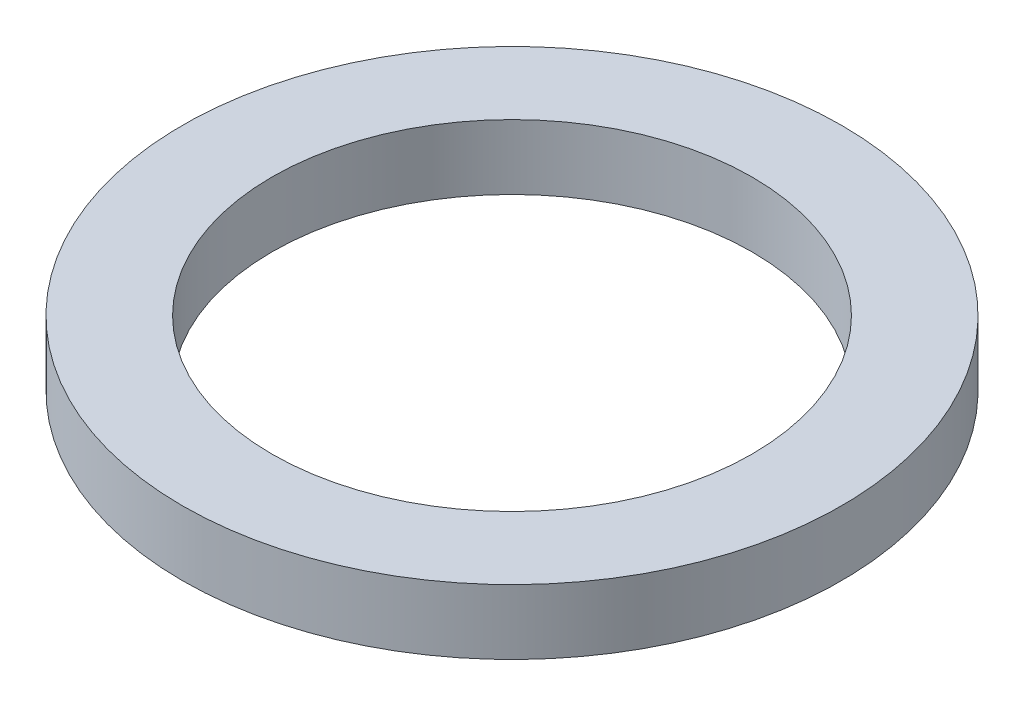
ISO-10303-21;
HEADER;
FILE_DESCRIPTION(('STEP AP214'),'2;1');
FILE_NAME('part.step','',(''),(''),'','','');
FILE_SCHEMA(('AUTOMOTIVE_DESIGN { 1 0 10303 214 1 1 1 1 }'));
ENDSEC;
DATA;
#1=APPLICATION_CONTEXT('core data for automotive mechanical design processes');
#2=APPLICATION_PROTOCOL_DEFINITION('international standard','automotive_design',2000,#1);
#3=PRODUCT_CONTEXT('',#1,'mechanical');
#4=PRODUCT('Part','Part','',(#3));
#5=PRODUCT_RELATED_PRODUCT_CATEGORY('part','',(#4));
#6=PRODUCT_DEFINITION_FORMATION('','',#4);
#7=PRODUCT_DEFINITION_CONTEXT('part definition',#1,'design');
#8=PRODUCT_DEFINITION('design','',#6,#7);
#9=PRODUCT_DEFINITION_SHAPE('','',#8);
#10=(LENGTH_UNIT() NAMED_UNIT(*) SI_UNIT(.MILLI.,.METRE.));
#11=(NAMED_UNIT(*) PLANE_ANGLE_UNIT() SI_UNIT($,.RADIAN.));
#12=(NAMED_UNIT(*) SI_UNIT($,.STERADIAN.) SOLID_ANGLE_UNIT());
#13=UNCERTAINTY_MEASURE_WITH_UNIT(LENGTH_MEASURE(1.E-05),#10,'distance_accuracy_value','');
#14=(GEOMETRIC_REPRESENTATION_CONTEXT(3) GLOBAL_UNCERTAINTY_ASSIGNED_CONTEXT((#13)) GLOBAL_UNIT_ASSIGNED_CONTEXT((#10,
#11,#12)) REPRESENTATION_CONTEXT('',''));
#15=CARTESIAN_POINT('',(0.,0.,0.));
#16=DIRECTION('',(0.,0.,1.));
#17=DIRECTION('',(1.,0.,0.));
#18=AXIS2_PLACEMENT_3D('',#15,#16,#17);
#19=CARTESIAN_POINT('',(0.,5.,0.));
#20=DIRECTION('',(0.,1.,0.));
#21=DIRECTION('',(0.,0.,1.));
#22=AXIS2_PLACEMENT_3D('',#19,#20,#21);
#23=PLANE('',#22);
#24=CARTESIAN_POINT('',(0.,5.,0.));
#25=DIRECTION('',(0.,1.,0.));
#26=DIRECTION('',(0.,0.,1.));
#27=AXIS2_PLACEMENT_3D('',#24,#25,#26);
#28=CIRCLE('',#27,25.4);
#29=CARTESIAN_POINT('',(0.,5.,25.4));
#30=VERTEX_POINT('',#29);
#31=EDGE_CURVE('E10',#30,#30,#28,.T.);
#32=ORIENTED_EDGE('',*,*,#31,.T.);
#33=EDGE_LOOP('',(#32));
#34=FACE_BOUND('',#33,.T.);
#35=CARTESIAN_POINT('',(0.,5.,0.));
#36=DIRECTION('',(0.,1.,0.));
#37=DIRECTION('',(0.,0.,1.));
#38=AXIS2_PLACEMENT_3D('',#35,#36,#37);
#39=CIRCLE('',#38,18.5);
#40=CARTESIAN_POINT('',(0.,5.,18.5));
#41=VERTEX_POINT('',#40);
#42=EDGE_CURVE('E42',#41,#41,#39,.T.);
#43=ORIENTED_EDGE('',*,*,#42,.F.);
#44=EDGE_LOOP('',(#43));
#45=FACE_BOUND('',#44,.T.);
#46=ADVANCED_FACE('F31',(#34,#45),#23,.T.);
#47=CARTESIAN_POINT('',(0.,0.,0.));
#48=DIRECTION('',(0.,1.,0.));
#49=DIRECTION('',(0.,0.,1.));
#50=AXIS2_PLACEMENT_3D('',#47,#48,#49);
#51=PLANE('',#50);
#52=CARTESIAN_POINT('',(0.,0.,0.));
#53=DIRECTION('',(0.,1.,0.));
#54=DIRECTION('',(0.,0.,1.));
#55=AXIS2_PLACEMENT_3D('',#52,#53,#54);
#56=CIRCLE('',#55,25.4);
#57=CARTESIAN_POINT('',(0.,0.,25.4));
#58=VERTEX_POINT('',#57);
#59=EDGE_CURVE('E35',#58,#58,#56,.T.);
#60=ORIENTED_EDGE('',*,*,#59,.F.);
#61=EDGE_LOOP('',(#60));
#62=FACE_BOUND('',#61,.T.);
#63=CARTESIAN_POINT('',(0.,0.,0.));
#64=DIRECTION('',(0.,1.,0.));
#65=DIRECTION('',(0.,0.,1.));
#66=AXIS2_PLACEMENT_3D('',#63,#64,#65);
#67=CIRCLE('',#66,18.5);
#68=CARTESIAN_POINT('',(0.,0.,18.5));
#69=VERTEX_POINT('',#68);
#70=EDGE_CURVE('E44',#69,#69,#67,.T.);
#71=ORIENTED_EDGE('',*,*,#70,.T.);
#72=EDGE_LOOP('',(#71));
#73=FACE_BOUND('',#72,.T.);
#74=ADVANCED_FACE('F54',(#62,#73),#51,.F.);
#75=CARTESIAN_POINT('',(0.,5.,0.));
#76=DIRECTION('',(0.,-1.,0.));
#77=DIRECTION('',(0.,0.,-1.));
#78=AXIS2_PLACEMENT_3D('',#75,#76,#77);
#79=CYLINDRICAL_SURFACE('',#78,25.4);
#80=ORIENTED_EDGE('',*,*,#31,.F.);
#81=EDGE_LOOP('',(#80));
#82=FACE_BOUND('',#81,.T.);
#83=ORIENTED_EDGE('',*,*,#59,.T.);
#84=EDGE_LOOP('',(#83));
#85=FACE_BOUND('',#84,.T.);
#86=ADVANCED_FACE('F33',(#82,#85),#79,.T.);
#87=CARTESIAN_POINT('',(0.,5.,0.));
#88=DIRECTION('',(0.,-1.,0.));
#89=DIRECTION('',(0.,0.,-1.));
#90=AXIS2_PLACEMENT_3D('',#87,#88,#89);
#91=CYLINDRICAL_SURFACE('',#90,18.5);
#92=ORIENTED_EDGE('',*,*,#42,.T.);
#93=EDGE_LOOP('',(#92));
#94=FACE_BOUND('',#93,.T.);
#95=ORIENTED_EDGE('',*,*,#70,.F.);
#96=EDGE_LOOP('',(#95));
#97=FACE_BOUND('',#96,.T.);
#98=ADVANCED_FACE('F50',(#94,#97),#91,.F.);
#99=CLOSED_SHELL('',(#46,#74,#86,#98));
#100=MANIFOLD_SOLID_BREP('B2',#99);
#101=ADVANCED_BREP_SHAPE_REPRESENTATION('',(#18,#100),#14);
#102=SHAPE_DEFINITION_REPRESENTATION(#9,#101);
ENDSEC;
END-ISO-10303-21;
